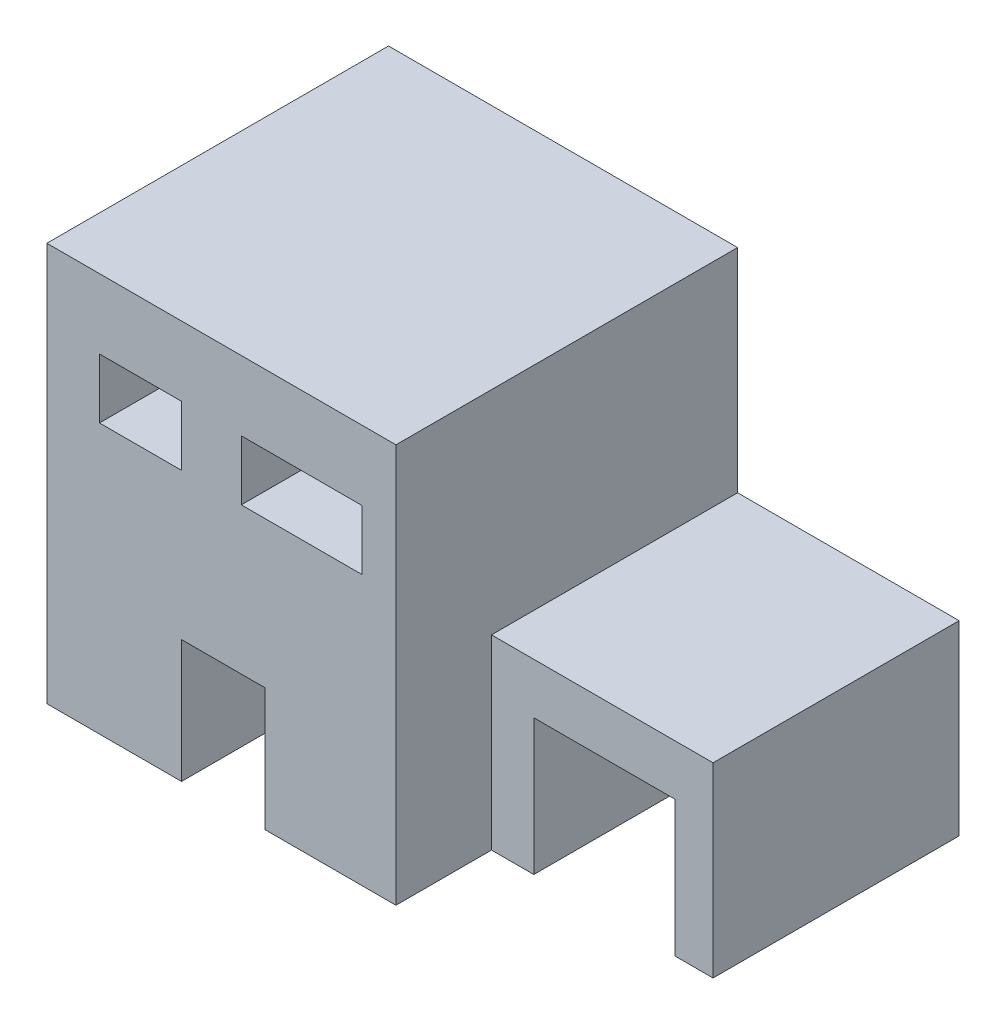
ISO-10303-21;
HEADER;
FILE_DESCRIPTION(('STEP AP214'),'2;1');
FILE_NAME('part.step','',(''),(''),'','','');
FILE_SCHEMA(('AUTOMOTIVE_DESIGN { 1 0 10303 214 1 1 1 1 }'));
ENDSEC;
DATA;
#1=APPLICATION_CONTEXT('core data for automotive mechanical design processes');
#2=APPLICATION_PROTOCOL_DEFINITION('international standard','automotive_design',2000,#1);
#3=PRODUCT_CONTEXT('',#1,'mechanical');
#4=PRODUCT('Part','Part','',(#3));
#5=PRODUCT_RELATED_PRODUCT_CATEGORY('part','',(#4));
#6=PRODUCT_DEFINITION_FORMATION('','',#4);
#7=PRODUCT_DEFINITION_CONTEXT('part definition',#1,'design');
#8=PRODUCT_DEFINITION('design','',#6,#7);
#9=PRODUCT_DEFINITION_SHAPE('','',#8);
#10=(LENGTH_UNIT() NAMED_UNIT(*) SI_UNIT(.MILLI.,.METRE.));
#11=(NAMED_UNIT(*) PLANE_ANGLE_UNIT() SI_UNIT($,.RADIAN.));
#12=(NAMED_UNIT(*) SI_UNIT($,.STERADIAN.) SOLID_ANGLE_UNIT());
#13=UNCERTAINTY_MEASURE_WITH_UNIT(LENGTH_MEASURE(1.E-05),#10,'distance_accuracy_value','');
#14=(GEOMETRIC_REPRESENTATION_CONTEXT(3) GLOBAL_UNCERTAINTY_ASSIGNED_CONTEXT((#13)) GLOBAL_UNIT_ASSIGNED_CONTEXT((#10,
#11,#12)) REPRESENTATION_CONTEXT('',''));
#15=CARTESIAN_POINT('',(0.,0.,0.));
#16=DIRECTION('',(0.,0.,1.));
#17=DIRECTION('',(1.,0.,0.));
#18=AXIS2_PLACEMENT_3D('',#15,#16,#17);
#19=CARTESIAN_POINT('',(0.,0.,0.));
#20=DIRECTION('',(0.,-1.,0.));
#21=DIRECTION('',(0.,0.,-1.));
#22=AXIS2_PLACEMENT_3D('',#19,#20,#21);
#23=PLANE('',#22);
#24=DIRECTION('',(0.,0.,1.));
#25=VECTOR('',#24,1.);
#26=CARTESIAN_POINT('',(88.3396516608017,0.,-110.));
#27=LINE('',#26,#25);
#28=CARTESIAN_POINT('',(88.3396516608017,0.,-77.1078953722334));
#29=VERTEX_POINT('',#28);
#30=CARTESIAN_POINT('',(88.3396516608017,0.,-21.5640714206499));
#31=VERTEX_POINT('',#30);
#32=EDGE_CURVE('E230',#29,#31,#27,.T.);
#33=ORIENTED_EDGE('',*,*,#32,.T.);
#34=DIRECTION('',(-1.,0.,0.));
#35=VECTOR('',#34,1.);
#36=CARTESIAN_POINT('',(128.786961770624,0.,-21.5640714206499));
#37=LINE('',#36,#35);
#38=CARTESIAN_POINT('',(78.7869617706238,0.,-21.5640714206499));
#39=VERTEX_POINT('',#38);
#40=EDGE_CURVE('E299',#31,#39,#37,.T.);
#41=ORIENTED_EDGE('',*,*,#40,.T.);
#42=DIRECTION('',(0.,0.,-1.));
#43=VECTOR('',#42,1.);
#44=CARTESIAN_POINT('',(78.7869617706238,0.,0.));
#45=LINE('',#44,#43);
#46=CARTESIAN_POINT('',(78.7869617706238,0.,0.));
#47=VERTEX_POINT('',#46);
#48=EDGE_CURVE('E321',#47,#39,#45,.T.);
#49=ORIENTED_EDGE('',*,*,#48,.F.);
#50=DIRECTION('',(1.,0.,0.));
#51=VECTOR('',#50,1.);
#52=CARTESIAN_POINT('',(0.,0.,0.));
#53=LINE('',#52,#51);
#54=CARTESIAN_POINT('',(49.1790629892825,0.,0.));
#55=VERTEX_POINT('',#54);
#56=EDGE_CURVE('E317',#55,#47,#53,.T.);
#57=ORIENTED_EDGE('',*,*,#56,.F.);
#58=DIRECTION('',(0.,0.,1.));
#59=VECTOR('',#58,1.);
#60=CARTESIAN_POINT('',(49.1790629892825,0.,0.));
#61=LINE('',#60,#59);
#62=CARTESIAN_POINT('',(49.1790629892825,0.,-77.1078953722334));
#63=VERTEX_POINT('',#62);
#64=EDGE_CURVE('E348',#63,#55,#61,.T.);
#65=ORIENTED_EDGE('',*,*,#64,.F.);
#66=DIRECTION('',(-1.,0.,0.));
#67=VECTOR('',#66,1.);
#68=CARTESIAN_POINT('',(0.,0.,-77.1078953722334));
#69=LINE('',#68,#67);
#70=EDGE_CURVE('E327',#29,#63,#69,.T.);
#71=ORIENTED_EDGE('',*,*,#70,.F.);
#72=EDGE_LOOP('',(#33,#41,#49,#57,#65,#71));
#73=FACE_BOUND('',#72,.T.);
#74=ADVANCED_FACE('F33',(#73),#23,.T.);
#75=DIRECTION('',(0.,0.,-1.));
#76=VECTOR('',#75,1.);
#77=CARTESIAN_POINT('',(30.3925643698374,0.,0.));
#78=LINE('',#77,#76);
#79=CARTESIAN_POINT('',(30.3925643698374,0.,0.));
#80=VERTEX_POINT('',#79);
#81=CARTESIAN_POINT('',(30.3925643698374,0.,-77.1078953722334));
#82=VERTEX_POINT('',#81);
#83=EDGE_CURVE('E350',#80,#82,#78,.T.);
#84=ORIENTED_EDGE('',*,*,#83,.F.);
#85=CARTESIAN_POINT('',(0.,0.,0.));
#86=VERTEX_POINT('',#85);
#87=EDGE_CURVE('E318',#86,#80,#53,.T.);
#88=ORIENTED_EDGE('',*,*,#87,.F.);
#89=DIRECTION('',(0.,0.,1.));
#90=VECTOR('',#89,1.);
#91=CARTESIAN_POINT('',(0.,0.,0.));
#92=LINE('',#91,#90);
#93=CARTESIAN_POINT('',(0.,0.,-77.1078953722334));
#94=VERTEX_POINT('',#93);
#95=EDGE_CURVE('E303',#94,#86,#92,.T.);
#96=ORIENTED_EDGE('',*,*,#95,.F.);
#97=EDGE_CURVE('E324',#82,#94,#69,.T.);
#98=ORIENTED_EDGE('',*,*,#97,.F.);
#99=EDGE_LOOP('',(#84,#88,#96,#98));
#100=FACE_BOUND('',#99,.T.);
#101=ADVANCED_FACE('F398',(#100),#23,.T.);
#102=CARTESIAN_POINT('',(78.7869617706238,90.,0.));
#103=DIRECTION('',(-1.,0.,0.));
#104=DIRECTION('',(0.,0.,1.));
#105=AXIS2_PLACEMENT_3D('',#102,#103,#104);
#106=PLANE('',#105);
#107=DIRECTION('',(0.,-1.,0.));
#108=VECTOR('',#107,1.);
#109=CARTESIAN_POINT('',(78.7869617706238,0.,-21.5640714206499));
#110=LINE('',#109,#108);
#111=CARTESIAN_POINT('',(78.7869617706238,42.0686481091275,-21.5640714206499));
#112=VERTEX_POINT('',#111);
#113=EDGE_CURVE('E277',#112,#39,#110,.T.);
#114=ORIENTED_EDGE('',*,*,#113,.F.);
#115=DIRECTION('',(0.,0.,1.));
#116=VECTOR('',#115,1.);
#117=CARTESIAN_POINT('',(78.7869617706238,42.0686481091275,-21.5640714206499));
#118=LINE('',#117,#116);
#119=CARTESIAN_POINT('',(78.7869617706238,42.0686481091275,-77.1078953722334));
#120=VERTEX_POINT('',#119);
#121=EDGE_CURVE('E282',#120,#112,#118,.T.);
#122=ORIENTED_EDGE('',*,*,#121,.F.);
#123=DIRECTION('',(0.,-1.,0.));
#124=VECTOR('',#123,1.);
#125=CARTESIAN_POINT('',(78.7869617706238,90.,-77.1078953722334));
#126=LINE('',#125,#124);
#127=CARTESIAN_POINT('',(78.7869617706238,90.,-77.1078953722334));
#128=VERTEX_POINT('',#127);
#129=EDGE_CURVE('E330',#128,#120,#126,.T.);
#130=ORIENTED_EDGE('',*,*,#129,.F.);
#131=DIRECTION('',(0.,0.,-1.));
#132=VECTOR('',#131,1.);
#133=CARTESIAN_POINT('',(78.7869617706238,90.,0.));
#134=LINE('',#133,#132);
#135=CARTESIAN_POINT('',(78.7869617706238,90.,0.));
#136=VERTEX_POINT('',#135);
#137=EDGE_CURVE('E310',#136,#128,#134,.T.);
#138=ORIENTED_EDGE('',*,*,#137,.F.);
#139=DIRECTION('',(0.,-1.,0.));
#140=VECTOR('',#139,1.);
#141=CARTESIAN_POINT('',(78.7869617706238,90.,0.));
#142=LINE('',#141,#140);
#143=EDGE_CURVE('E333',#136,#47,#142,.T.);
#144=ORIENTED_EDGE('',*,*,#143,.T.);
#145=ORIENTED_EDGE('',*,*,#48,.T.);
#146=EDGE_LOOP('',(#114,#122,#130,#138,#144,#145));
#147=FACE_BOUND('',#146,.T.);
#148=ADVANCED_FACE('F405',(#147),#106,.F.);
#149=CARTESIAN_POINT('',(0.,90.,0.));
#150=DIRECTION('',(1.,0.,0.));
#151=DIRECTION('',(0.,0.,-1.));
#152=AXIS2_PLACEMENT_3D('',#149,#150,#151);
#153=PLANE('',#152);
#154=ORIENTED_EDGE('',*,*,#95,.T.);
#155=DIRECTION('',(0.,-1.,0.));
#156=VECTOR('',#155,1.);
#157=CARTESIAN_POINT('',(0.,90.,0.));
#158=LINE('',#157,#156);
#159=CARTESIAN_POINT('',(0.,90.,0.));
#160=VERTEX_POINT('',#159);
#161=EDGE_CURVE('E336',#160,#86,#158,.T.);
#162=ORIENTED_EDGE('',*,*,#161,.F.);
#163=DIRECTION('',(0.,0.,1.));
#164=VECTOR('',#163,1.);
#165=CARTESIAN_POINT('',(0.,90.,0.));
#166=LINE('',#165,#164);
#167=CARTESIAN_POINT('',(0.,90.,-77.1078953722334));
#168=VERTEX_POINT('',#167);
#169=EDGE_CURVE('E304',#168,#160,#166,.T.);
#170=ORIENTED_EDGE('',*,*,#169,.F.);
#171=DIRECTION('',(0.,-1.,0.));
#172=VECTOR('',#171,1.);
#173=CARTESIAN_POINT('',(0.,90.,-77.1078953722334));
#174=LINE('',#173,#172);
#175=EDGE_CURVE('E314',#168,#94,#174,.T.);
#176=ORIENTED_EDGE('',*,*,#175,.T.);
#177=EDGE_LOOP('',(#154,#162,#170,#176));
#178=FACE_BOUND('',#177,.T.);
#179=ADVANCED_FACE('F35',(#178),#153,.F.);
#180=CARTESIAN_POINT('',(0.,90.,0.));
#181=DIRECTION('',(0.,0.,-1.));
#182=DIRECTION('',(-1.,0.,0.));
#183=AXIS2_PLACEMENT_3D('',#180,#181,#182);
#184=PLANE('',#183);
#185=DIRECTION('',(1.,0.,0.));
#186=VECTOR('',#185,1.);
#187=CARTESIAN_POINT('',(11.8706643224973,60.8097646832656,0.));
#188=LINE('',#187,#186);
#189=CARTESIAN_POINT('',(11.8706643224973,60.8097646832656,0.));
#190=VERTEX_POINT('',#189);
#191=CARTESIAN_POINT('',(30.3925643698374,60.8097646832656,0.));
#192=VERTEX_POINT('',#191);
#193=EDGE_CURVE('E235',#190,#192,#188,.T.);
#194=ORIENTED_EDGE('',*,*,#193,.F.);
#195=DIRECTION('',(0.,-1.,0.));
#196=VECTOR('',#195,1.);
#197=CARTESIAN_POINT('',(11.8706643224973,74.3042918606135,0.));
#198=LINE('',#197,#196);
#199=CARTESIAN_POINT('',(11.8706643224973,74.3042918606135,0.));
#200=VERTEX_POINT('',#199);
#201=EDGE_CURVE('E48',#200,#190,#198,.T.);
#202=ORIENTED_EDGE('',*,*,#201,.F.);
#203=DIRECTION('',(-1.,0.,0.));
#204=VECTOR('',#203,1.);
#205=CARTESIAN_POINT('',(11.8706643224973,74.3042918606135,0.));
#206=LINE('',#205,#204);
#207=CARTESIAN_POINT('',(30.3925643698374,74.3042918606135,0.));
#208=VERTEX_POINT('',#207);
#209=EDGE_CURVE('E241',#208,#200,#206,.T.);
#210=ORIENTED_EDGE('',*,*,#209,.F.);
#211=DIRECTION('',(0.,1.,0.));
#212=VECTOR('',#211,1.);
#213=CARTESIAN_POINT('',(30.3925643698374,74.3042918606135,0.));
#214=LINE('',#213,#212);
#215=EDGE_CURVE('E238',#192,#208,#214,.T.);
#216=ORIENTED_EDGE('',*,*,#215,.F.);
#217=EDGE_LOOP('',(#194,#202,#210,#216));
#218=FACE_BOUND('',#217,.T.);
#219=DIRECTION('',(1.,0.,0.));
#220=VECTOR('',#219,1.);
#221=CARTESIAN_POINT('',(43.8870915471853,60.8097646832656,0.));
#222=LINE('',#221,#220);
#223=CARTESIAN_POINT('',(43.8870915471853,60.8097646832656,0.));
#224=VERTEX_POINT('',#223);
#225=CARTESIAN_POINT('',(71.1407444739858,60.8097646832656,0.));
#226=VERTEX_POINT('',#225);
#227=EDGE_CURVE('E205',#224,#226,#222,.T.);
#228=ORIENTED_EDGE('',*,*,#227,.F.);
#229=DIRECTION('',(0.,-1.,0.));
#230=VECTOR('',#229,1.);
#231=CARTESIAN_POINT('',(43.8870915471853,74.3042918606135,0.));
#232=LINE('',#231,#230);
#233=CARTESIAN_POINT('',(43.8870915471853,74.3042918606135,0.));
#234=VERTEX_POINT('',#233);
#235=EDGE_CURVE('E56',#234,#224,#232,.T.);
#236=ORIENTED_EDGE('',*,*,#235,.F.);
#237=DIRECTION('',(-1.,0.,0.));
#238=VECTOR('',#237,1.);
#239=CARTESIAN_POINT('',(43.8870915471853,74.3042918606135,0.));
#240=LINE('',#239,#238);
#241=CARTESIAN_POINT('',(71.1407444739858,74.3042918606135,0.));
#242=VERTEX_POINT('',#241);
#243=EDGE_CURVE('E212',#242,#234,#240,.T.);
#244=ORIENTED_EDGE('',*,*,#243,.F.);
#245=DIRECTION('',(0.,1.,0.));
#246=VECTOR('',#245,1.);
#247=CARTESIAN_POINT('',(71.1407444739858,74.3042918606135,0.));
#248=LINE('',#247,#246);
#249=EDGE_CURVE('E195',#226,#242,#248,.T.);
#250=ORIENTED_EDGE('',*,*,#249,.F.);
#251=EDGE_LOOP('',(#228,#236,#244,#250));
#252=FACE_BOUND('',#251,.T.);
#253=ORIENTED_EDGE('',*,*,#87,.T.);
#254=DIRECTION('',(0.,-1.,0.));
#255=VECTOR('',#254,1.);
#256=CARTESIAN_POINT('',(30.3925643698374,0.,0.));
#257=LINE('',#256,#255);
#258=CARTESIAN_POINT('',(30.3925643698374,27.7349431701582,0.));
#259=VERTEX_POINT('',#258);
#260=EDGE_CURVE('E224',#259,#80,#257,.T.);
#261=ORIENTED_EDGE('',*,*,#260,.F.);
#262=DIRECTION('',(-1.,0.,0.));
#263=VECTOR('',#262,1.);
#264=CARTESIAN_POINT('',(30.3925643698374,27.7349431701582,0.));
#265=LINE('',#264,#263);
#266=CARTESIAN_POINT('',(49.1790629892825,27.7349431701582,0.));
#267=VERTEX_POINT('',#266);
#268=EDGE_CURVE('E255',#267,#259,#265,.T.);
#269=ORIENTED_EDGE('',*,*,#268,.F.);
#270=DIRECTION('',(0.,1.,0.));
#271=VECTOR('',#270,1.);
#272=CARTESIAN_POINT('',(49.1790629892825,0.,0.));
#273=LINE('',#272,#271);
#274=EDGE_CURVE('E252',#55,#267,#273,.T.);
#275=ORIENTED_EDGE('',*,*,#274,.F.);
#276=ORIENTED_EDGE('',*,*,#56,.T.);
#277=ORIENTED_EDGE('',*,*,#143,.F.);
#278=DIRECTION('',(1.,0.,0.));
#279=VECTOR('',#278,1.);
#280=CARTESIAN_POINT('',(0.,90.,0.));
#281=LINE('',#280,#279);
#282=EDGE_CURVE('E307',#160,#136,#281,.T.);
#283=ORIENTED_EDGE('',*,*,#282,.F.);
#284=ORIENTED_EDGE('',*,*,#161,.T.);
#285=EDGE_LOOP('',(#253,#261,#269,#275,#276,#277,#283,#284));
#286=FACE_BOUND('',#285,.T.);
#287=ADVANCED_FACE('F209',(#218,#252,#286),#184,.F.);
#288=CARTESIAN_POINT('',(0.,90.,-77.1078953722334));
#289=DIRECTION('',(0.,0.,1.));
#290=DIRECTION('',(1.,0.,0.));
#291=AXIS2_PLACEMENT_3D('',#288,#289,#290);
#292=PLANE('',#291);
#293=DIRECTION('',(-1.,0.,0.));
#294=VECTOR('',#293,1.);
#295=CARTESIAN_POINT('',(0.,74.3042918606135,-77.1078953722334));
#296=LINE('',#295,#294);
#297=CARTESIAN_POINT('',(30.3925643698374,74.3042918606135,-77.1078953722334));
#298=VERTEX_POINT('',#297);
#299=CARTESIAN_POINT('',(11.8706643224973,74.3042918606135,-77.1078953722334));
#300=VERTEX_POINT('',#299);
#301=EDGE_CURVE('E41',#298,#300,#296,.T.);
#302=ORIENTED_EDGE('',*,*,#301,.T.);
#303=DIRECTION('',(0.,-1.,0.));
#304=VECTOR('',#303,1.);
#305=CARTESIAN_POINT('',(11.8706643224973,90.,-77.1078953722334));
#306=LINE('',#305,#304);
#307=CARTESIAN_POINT('',(11.8706643224973,60.8097646832656,-77.1078953722334));
#308=VERTEX_POINT('',#307);
#309=EDGE_CURVE('E11',#300,#308,#306,.T.);
#310=ORIENTED_EDGE('',*,*,#309,.T.);
#311=DIRECTION('',(1.,0.,0.));
#312=VECTOR('',#311,1.);
#313=CARTESIAN_POINT('',(0.,60.8097646832656,-77.1078953722334));
#314=LINE('',#313,#312);
#315=CARTESIAN_POINT('',(30.3925643698374,60.8097646832656,-77.1078953722334));
#316=VERTEX_POINT('',#315);
#317=EDGE_CURVE('E364',#308,#316,#314,.T.);
#318=ORIENTED_EDGE('',*,*,#317,.T.);
#319=DIRECTION('',(0.,1.,0.));
#320=VECTOR('',#319,1.);
#321=CARTESIAN_POINT('',(30.3925643698374,90.,-77.1078953722334));
#322=LINE('',#321,#320);
#323=EDGE_CURVE('E367',#316,#298,#322,.T.);
#324=ORIENTED_EDGE('',*,*,#323,.T.);
#325=EDGE_LOOP('',(#302,#310,#318,#324));
#326=FACE_BOUND('',#325,.T.);
#327=DIRECTION('',(-1.,0.,0.));
#328=VECTOR('',#327,1.);
#329=CARTESIAN_POINT('',(0.,74.3042918606135,-77.1078953722334));
#330=LINE('',#329,#328);
#331=CARTESIAN_POINT('',(71.1407444739858,74.3042918606135,-77.1078953722334));
#332=VERTEX_POINT('',#331);
#333=CARTESIAN_POINT('',(43.8870915471853,74.3042918606135,-77.1078953722334));
#334=VERTEX_POINT('',#333);
#335=EDGE_CURVE('E358',#332,#334,#330,.T.);
#336=ORIENTED_EDGE('',*,*,#335,.T.);
#337=DIRECTION('',(0.,-1.,0.));
#338=VECTOR('',#337,1.);
#339=CARTESIAN_POINT('',(43.8870915471853,90.,-77.1078953722334));
#340=LINE('',#339,#338);
#341=CARTESIAN_POINT('',(43.8870915471853,60.8097646832656,-77.1078953722334));
#342=VERTEX_POINT('',#341);
#343=EDGE_CURVE('E361',#334,#342,#340,.T.);
#344=ORIENTED_EDGE('',*,*,#343,.T.);
#345=DIRECTION('',(1.,0.,0.));
#346=VECTOR('',#345,1.);
#347=CARTESIAN_POINT('',(0.,60.8097646832656,-77.1078953722334));
#348=LINE('',#347,#346);
#349=CARTESIAN_POINT('',(71.1407444739858,60.8097646832656,-77.1078953722334));
#350=VERTEX_POINT('',#349);
#351=EDGE_CURVE('E355',#342,#350,#348,.T.);
#352=ORIENTED_EDGE('',*,*,#351,.T.);
#353=DIRECTION('',(0.,1.,0.));
#354=VECTOR('',#353,1.);
#355=CARTESIAN_POINT('',(71.1407444739858,90.,-77.1078953722334));
#356=LINE('',#355,#354);
#357=EDGE_CURVE('E198',#350,#332,#356,.T.);
#358=ORIENTED_EDGE('',*,*,#357,.T.);
#359=EDGE_LOOP('',(#336,#344,#352,#358));
#360=FACE_BOUND('',#359,.T.);
#361=DIRECTION('',(-1.,0.,0.));
#362=VECTOR('',#361,1.);
#363=CARTESIAN_POINT('',(0.,30.6455274633116,-77.1078953722334));
#364=LINE('',#363,#362);
#365=CARTESIAN_POINT('',(120.223779599437,30.6455274633116,-77.1078953722334));
#366=VERTEX_POINT('',#365);
#367=CARTESIAN_POINT('',(88.3396516608017,30.6455274633116,-77.1078953722334));
#368=VERTEX_POINT('',#367);
#369=EDGE_CURVE('E265',#366,#368,#364,.T.);
#370=ORIENTED_EDGE('',*,*,#369,.T.);
#371=DIRECTION('',(0.,-1.,0.));
#372=VECTOR('',#371,1.);
#373=CARTESIAN_POINT('',(88.3396516608017,90.,-77.1078953722334));
#374=LINE('',#373,#372);
#375=EDGE_CURVE('E268',#368,#29,#374,.T.);
#376=ORIENTED_EDGE('',*,*,#375,.T.);
#377=ORIENTED_EDGE('',*,*,#70,.T.);
#378=DIRECTION('',(0.,1.,0.));
#379=VECTOR('',#378,1.);
#380=CARTESIAN_POINT('',(49.1790629892825,90.,-77.1078953722334));
#381=LINE('',#380,#379);
#382=CARTESIAN_POINT('',(49.1790629892825,27.7349431701582,-77.1078953722334));
#383=VERTEX_POINT('',#382);
#384=EDGE_CURVE('E271',#63,#383,#381,.T.);
#385=ORIENTED_EDGE('',*,*,#384,.T.);
#386=DIRECTION('',(-1.,0.,0.));
#387=VECTOR('',#386,1.);
#388=CARTESIAN_POINT('',(0.,27.7349431701582,-77.1078953722334));
#389=LINE('',#388,#387);
#390=CARTESIAN_POINT('',(30.3925643698374,27.7349431701582,-77.1078953722334));
#391=VERTEX_POINT('',#390);
#392=EDGE_CURVE('E352',#383,#391,#389,.T.);
#393=ORIENTED_EDGE('',*,*,#392,.T.);
#394=DIRECTION('',(0.,-1.,0.));
#395=VECTOR('',#394,1.);
#396=CARTESIAN_POINT('',(30.3925643698374,90.,-77.1078953722334));
#397=LINE('',#396,#395);
#398=EDGE_CURVE('E274',#391,#82,#397,.T.);
#399=ORIENTED_EDGE('',*,*,#398,.T.);
#400=ORIENTED_EDGE('',*,*,#97,.T.);
#401=ORIENTED_EDGE('',*,*,#175,.F.);
#402=DIRECTION('',(-1.,0.,0.));
#403=VECTOR('',#402,1.);
#404=CARTESIAN_POINT('',(0.,90.,-77.1078953722334));
#405=LINE('',#404,#403);
#406=EDGE_CURVE('E312',#128,#168,#405,.T.);
#407=ORIENTED_EDGE('',*,*,#406,.F.);
#408=ORIENTED_EDGE('',*,*,#129,.T.);
#409=DIRECTION('',(-1.,0.,0.));
#410=VECTOR('',#409,1.);
#411=CARTESIAN_POINT('',(128.786961770624,42.0686481091275,-77.1078953722334));
#412=LINE('',#411,#410);
#413=CARTESIAN_POINT('',(128.786961770624,42.0686481091275,-77.1078953722334));
#414=VERTEX_POINT('',#413);
#415=EDGE_CURVE('E296',#414,#120,#412,.T.);
#416=ORIENTED_EDGE('',*,*,#415,.F.);
#417=DIRECTION('',(0.,1.,0.));
#418=VECTOR('',#417,1.);
#419=CARTESIAN_POINT('',(128.786961770624,0.,-77.1078953722334));
#420=LINE('',#419,#418);
#421=CARTESIAN_POINT('',(128.786961770624,0.,-77.1078953722334));
#422=VERTEX_POINT('',#421);
#423=EDGE_CURVE('E285',#422,#414,#420,.T.);
#424=ORIENTED_EDGE('',*,*,#423,.F.);
#425=CARTESIAN_POINT('',(120.223779599437,0.,-77.1078953722334));
#426=VERTEX_POINT('',#425);
#427=EDGE_CURVE('E308',#422,#426,#69,.T.);
#428=ORIENTED_EDGE('',*,*,#427,.T.);
#429=DIRECTION('',(0.,1.,0.));
#430=VECTOR('',#429,1.);
#431=CARTESIAN_POINT('',(120.223779599437,90.,-77.1078953722334));
#432=LINE('',#431,#430);
#433=EDGE_CURVE('E261',#426,#366,#432,.T.);
#434=ORIENTED_EDGE('',*,*,#433,.T.);
#435=EDGE_LOOP('',(#370,#376,#377,#385,#393,#399,#400,#401,#407,#408,#416,#424,#428,#434));
#436=FACE_BOUND('',#435,.T.);
#437=ADVANCED_FACE('F371',(#326,#360,#436),#292,.F.);
#438=CARTESIAN_POINT('',(0.,90.,0.));
#439=DIRECTION('',(0.,-1.,0.));
#440=DIRECTION('',(0.,0.,-1.));
#441=AXIS2_PLACEMENT_3D('',#438,#439,#440);
#442=PLANE('',#441);
#443=ORIENTED_EDGE('',*,*,#169,.T.);
#444=ORIENTED_EDGE('',*,*,#282,.T.);
#445=ORIENTED_EDGE('',*,*,#137,.T.);
#446=ORIENTED_EDGE('',*,*,#406,.T.);
#447=EDGE_LOOP('',(#443,#444,#445,#446));
#448=FACE_BOUND('',#447,.T.);
#449=ADVANCED_FACE('F411',(#448),#442,.F.);
#450=DIRECTION('',(0.,0.,1.));
#451=VECTOR('',#450,1.);
#452=CARTESIAN_POINT('',(120.223779599437,0.,-110.));
#453=LINE('',#452,#451);
#454=CARTESIAN_POINT('',(120.223779599437,0.,-21.5640714206499));
#455=VERTEX_POINT('',#454);
#456=EDGE_CURVE('E228',#426,#455,#453,.T.);
#457=ORIENTED_EDGE('',*,*,#456,.F.);
#458=ORIENTED_EDGE('',*,*,#427,.F.);
#459=DIRECTION('',(0.,0.,-1.));
#460=VECTOR('',#459,1.);
#461=CARTESIAN_POINT('',(128.786961770624,0.,-21.5640714206499));
#462=LINE('',#461,#460);
#463=CARTESIAN_POINT('',(128.786961770624,0.,-21.5640714206499));
#464=VERTEX_POINT('',#463);
#465=EDGE_CURVE('E281',#464,#422,#462,.T.);
#466=ORIENTED_EDGE('',*,*,#465,.F.);
#467=EDGE_CURVE('E300',#464,#455,#37,.T.);
#468=ORIENTED_EDGE('',*,*,#467,.T.);
#469=EDGE_LOOP('',(#457,#458,#466,#468));
#470=FACE_BOUND('',#469,.T.);
#471=ADVANCED_FACE('F401',(#470),#23,.T.);
#472=CARTESIAN_POINT('',(128.786961770624,0.,-21.5640714206499));
#473=DIRECTION('',(0.,0.,-1.));
#474=DIRECTION('',(-1.,0.,0.));
#475=AXIS2_PLACEMENT_3D('',#472,#473,#474);
#476=PLANE('',#475);
#477=ORIENTED_EDGE('',*,*,#40,.F.);
#478=DIRECTION('',(0.,1.,0.));
#479=VECTOR('',#478,1.);
#480=CARTESIAN_POINT('',(88.3396516608017,0.,-21.5640714206499));
#481=LINE('',#480,#479);
#482=CARTESIAN_POINT('',(88.3396516608017,30.6455274633116,-21.5640714206499));
#483=VERTEX_POINT('',#482);
#484=EDGE_CURVE('E345',#31,#483,#481,.T.);
#485=ORIENTED_EDGE('',*,*,#484,.T.);
#486=DIRECTION('',(1.,0.,0.));
#487=VECTOR('',#486,1.);
#488=CARTESIAN_POINT('',(128.786961770624,30.6455274633116,-21.5640714206499));
#489=LINE('',#488,#487);
#490=CARTESIAN_POINT('',(120.223779599437,30.6455274633116,-21.5640714206499));
#491=VERTEX_POINT('',#490);
#492=EDGE_CURVE('E342',#483,#491,#489,.T.);
#493=ORIENTED_EDGE('',*,*,#492,.T.);
#494=DIRECTION('',(0.,-1.,0.));
#495=VECTOR('',#494,1.);
#496=CARTESIAN_POINT('',(120.223779599437,0.,-21.5640714206499));
#497=LINE('',#496,#495);
#498=EDGE_CURVE('E339',#491,#455,#497,.T.);
#499=ORIENTED_EDGE('',*,*,#498,.T.);
#500=ORIENTED_EDGE('',*,*,#467,.F.);
#501=DIRECTION('',(0.,-1.,0.));
#502=VECTOR('',#501,1.);
#503=CARTESIAN_POINT('',(128.786961770624,0.,-21.5640714206499));
#504=LINE('',#503,#502);
#505=CARTESIAN_POINT('',(128.786961770624,42.0686481091275,-21.5640714206499));
#506=VERTEX_POINT('',#505);
#507=EDGE_CURVE('E278',#506,#464,#504,.T.);
#508=ORIENTED_EDGE('',*,*,#507,.F.);
#509=DIRECTION('',(-1.,0.,0.));
#510=VECTOR('',#509,1.);
#511=CARTESIAN_POINT('',(128.786961770624,42.0686481091275,-21.5640714206499));
#512=LINE('',#511,#510);
#513=EDGE_CURVE('E289',#506,#112,#512,.T.);
#514=ORIENTED_EDGE('',*,*,#513,.T.);
#515=ORIENTED_EDGE('',*,*,#113,.T.);
#516=EDGE_LOOP('',(#477,#485,#493,#499,#500,#508,#514,#515));
#517=FACE_BOUND('',#516,.T.);
#518=ADVANCED_FACE('F410',(#517),#476,.F.);
#519=CARTESIAN_POINT('',(128.786961770624,42.0686481091275,-21.5640714206499));
#520=DIRECTION('',(0.,-1.,0.));
#521=DIRECTION('',(0.,0.,-1.));
#522=AXIS2_PLACEMENT_3D('',#519,#520,#521);
#523=PLANE('',#522);
#524=ORIENTED_EDGE('',*,*,#121,.T.);
#525=ORIENTED_EDGE('',*,*,#513,.F.);
#526=DIRECTION('',(0.,0.,1.));
#527=VECTOR('',#526,1.);
#528=CARTESIAN_POINT('',(128.786961770624,42.0686481091275,-21.5640714206499));
#529=LINE('',#528,#527);
#530=EDGE_CURVE('E287',#414,#506,#529,.T.);
#531=ORIENTED_EDGE('',*,*,#530,.F.);
#532=ORIENTED_EDGE('',*,*,#415,.T.);
#533=EDGE_LOOP('',(#524,#525,#531,#532));
#534=FACE_BOUND('',#533,.T.);
#535=ADVANCED_FACE('F417',(#534),#523,.F.);
#536=CARTESIAN_POINT('',(128.786961770624,0.,0.));
#537=DIRECTION('',(-1.,0.,0.));
#538=DIRECTION('',(0.,0.,1.));
#539=AXIS2_PLACEMENT_3D('',#536,#537,#538);
#540=PLANE('',#539);
#541=ORIENTED_EDGE('',*,*,#507,.T.);
#542=ORIENTED_EDGE('',*,*,#465,.T.);
#543=ORIENTED_EDGE('',*,*,#423,.T.);
#544=ORIENTED_EDGE('',*,*,#530,.T.);
#545=EDGE_LOOP('',(#541,#542,#543,#544));
#546=FACE_BOUND('',#545,.T.);
#547=ADVANCED_FACE('F429',(#546),#540,.F.);
#548=CARTESIAN_POINT('',(88.3396516608017,0.,-110.));
#549=DIRECTION('',(-1.,0.,0.));
#550=DIRECTION('',(0.,0.,1.));
#551=AXIS2_PLACEMENT_3D('',#548,#549,#550);
#552=PLANE('',#551);
#553=DIRECTION('',(0.,0.,1.));
#554=VECTOR('',#553,1.);
#555=CARTESIAN_POINT('',(88.3396516608017,30.6455274633116,-110.));
#556=LINE('',#555,#554);
#557=EDGE_CURVE('E221',#368,#483,#556,.T.);
#558=ORIENTED_EDGE('',*,*,#557,.T.);
#559=ORIENTED_EDGE('',*,*,#484,.F.);
#560=ORIENTED_EDGE('',*,*,#32,.F.);
#561=ORIENTED_EDGE('',*,*,#375,.F.);
#562=EDGE_LOOP('',(#558,#559,#560,#561));
#563=FACE_BOUND('',#562,.T.);
#564=ADVANCED_FACE('F479',(#563),#552,.F.);
#565=CARTESIAN_POINT('',(88.3396516608017,30.6455274633116,-110.));
#566=DIRECTION('',(0.,1.,0.));
#567=DIRECTION('',(0.,0.,1.));
#568=AXIS2_PLACEMENT_3D('',#565,#566,#567);
#569=PLANE('',#568);
#570=DIRECTION('',(0.,0.,1.));
#571=VECTOR('',#570,1.);
#572=CARTESIAN_POINT('',(120.223779599437,30.6455274633116,-110.));
#573=LINE('',#572,#571);
#574=EDGE_CURVE('E225',#366,#491,#573,.T.);
#575=ORIENTED_EDGE('',*,*,#574,.T.);
#576=ORIENTED_EDGE('',*,*,#492,.F.);
#577=ORIENTED_EDGE('',*,*,#557,.F.);
#578=ORIENTED_EDGE('',*,*,#369,.F.);
#579=EDGE_LOOP('',(#575,#576,#577,#578));
#580=FACE_BOUND('',#579,.T.);
#581=ADVANCED_FACE('F436',(#580),#569,.F.);
#582=CARTESIAN_POINT('',(120.223779599437,0.,-110.));
#583=DIRECTION('',(1.,0.,0.));
#584=DIRECTION('',(0.,0.,-1.));
#585=AXIS2_PLACEMENT_3D('',#582,#583,#584);
#586=PLANE('',#585);
#587=ORIENTED_EDGE('',*,*,#456,.T.);
#588=ORIENTED_EDGE('',*,*,#498,.F.);
#589=ORIENTED_EDGE('',*,*,#574,.F.);
#590=ORIENTED_EDGE('',*,*,#433,.F.);
#591=EDGE_LOOP('',(#587,#588,#589,#590));
#592=FACE_BOUND('',#591,.T.);
#593=ADVANCED_FACE('F434',(#592),#586,.F.);
#594=CARTESIAN_POINT('',(30.3925643698374,27.7349431701582,-110.));
#595=DIRECTION('',(0.,1.,0.));
#596=DIRECTION('',(0.,0.,1.));
#597=AXIS2_PLACEMENT_3D('',#594,#595,#596);
#598=PLANE('',#597);
#599=DIRECTION('',(0.,0.,1.));
#600=VECTOR('',#599,1.);
#601=CARTESIAN_POINT('',(49.1790629892825,27.7349431701582,-110.));
#602=LINE('',#601,#600);
#603=EDGE_CURVE('E258',#383,#267,#602,.T.);
#604=ORIENTED_EDGE('',*,*,#603,.T.);
#605=ORIENTED_EDGE('',*,*,#268,.T.);
#606=DIRECTION('',(0.,0.,1.));
#607=VECTOR('',#606,1.);
#608=CARTESIAN_POINT('',(30.3925643698374,27.7349431701582,-110.));
#609=LINE('',#608,#607);
#610=EDGE_CURVE('E259',#391,#259,#609,.T.);
#611=ORIENTED_EDGE('',*,*,#610,.F.);
#612=ORIENTED_EDGE('',*,*,#392,.F.);
#613=EDGE_LOOP('',(#604,#605,#611,#612));
#614=FACE_BOUND('',#613,.T.);
#615=ADVANCED_FACE('F465',(#614),#598,.F.);
#616=CARTESIAN_POINT('',(30.3925643698374,0.,-110.));
#617=DIRECTION('',(-1.,0.,0.));
#618=DIRECTION('',(0.,0.,1.));
#619=AXIS2_PLACEMENT_3D('',#616,#617,#618);
#620=PLANE('',#619);
#621=ORIENTED_EDGE('',*,*,#610,.T.);
#622=ORIENTED_EDGE('',*,*,#260,.T.);
#623=ORIENTED_EDGE('',*,*,#83,.T.);
#624=ORIENTED_EDGE('',*,*,#398,.F.);
#625=EDGE_LOOP('',(#621,#622,#623,#624));
#626=FACE_BOUND('',#625,.T.);
#627=ADVANCED_FACE('F467',(#626),#620,.F.);
#628=CARTESIAN_POINT('',(49.1790629892825,0.,-110.));
#629=DIRECTION('',(1.,0.,0.));
#630=DIRECTION('',(0.,0.,-1.));
#631=AXIS2_PLACEMENT_3D('',#628,#629,#630);
#632=PLANE('',#631);
#633=ORIENTED_EDGE('',*,*,#64,.T.);
#634=ORIENTED_EDGE('',*,*,#274,.T.);
#635=ORIENTED_EDGE('',*,*,#603,.F.);
#636=ORIENTED_EDGE('',*,*,#384,.F.);
#637=EDGE_LOOP('',(#633,#634,#635,#636));
#638=FACE_BOUND('',#637,.T.);
#639=ADVANCED_FACE('F462',(#638),#632,.F.);
#640=CARTESIAN_POINT('',(43.8870915471853,74.3042918606135,-110.));
#641=DIRECTION('',(-1.,0.,0.));
#642=DIRECTION('',(0.,0.,1.));
#643=AXIS2_PLACEMENT_3D('',#640,#641,#642);
#644=PLANE('',#643);
#645=DIRECTION('',(0.,0.,1.));
#646=VECTOR('',#645,1.);
#647=CARTESIAN_POINT('',(43.8870915471853,74.3042918606135,-110.));
#648=LINE('',#647,#646);
#649=EDGE_CURVE('E217',#334,#234,#648,.T.);
#650=ORIENTED_EDGE('',*,*,#649,.T.);
#651=ORIENTED_EDGE('',*,*,#235,.T.);
#652=DIRECTION('',(0.,0.,1.));
#653=VECTOR('',#652,1.);
#654=CARTESIAN_POINT('',(43.8870915471853,60.8097646832656,-110.));
#655=LINE('',#654,#653);
#656=EDGE_CURVE('E202',#342,#224,#655,.T.);
#657=ORIENTED_EDGE('',*,*,#656,.F.);
#658=ORIENTED_EDGE('',*,*,#343,.F.);
#659=EDGE_LOOP('',(#650,#651,#657,#658));
#660=FACE_BOUND('',#659,.T.);
#661=ADVANCED_FACE('F474',(#660),#644,.F.);
#662=CARTESIAN_POINT('',(43.8870915471853,74.3042918606135,-110.));
#663=DIRECTION('',(0.,1.,0.));
#664=DIRECTION('',(0.,0.,1.));
#665=AXIS2_PLACEMENT_3D('',#662,#663,#664);
#666=PLANE('',#665);
#667=DIRECTION('',(0.,0.,1.));
#668=VECTOR('',#667,1.);
#669=CARTESIAN_POINT('',(71.1407444739858,74.3042918606135,-110.));
#670=LINE('',#669,#668);
#671=EDGE_CURVE('E201',#332,#242,#670,.T.);
#672=ORIENTED_EDGE('',*,*,#671,.T.);
#673=ORIENTED_EDGE('',*,*,#243,.T.);
#674=ORIENTED_EDGE('',*,*,#649,.F.);
#675=ORIENTED_EDGE('',*,*,#335,.F.);
#676=EDGE_LOOP('',(#672,#673,#674,#675));
#677=FACE_BOUND('',#676,.T.);
#678=ADVANCED_FACE('F531',(#677),#666,.F.);
#679=CARTESIAN_POINT('',(71.1407444739858,74.3042918606135,-110.));
#680=DIRECTION('',(1.,0.,0.));
#681=DIRECTION('',(0.,0.,-1.));
#682=AXIS2_PLACEMENT_3D('',#679,#680,#681);
#683=PLANE('',#682);
#684=DIRECTION('',(0.,0.,1.));
#685=VECTOR('',#684,1.);
#686=CARTESIAN_POINT('',(71.1407444739858,60.8097646832656,-110.));
#687=LINE('',#686,#685);
#688=EDGE_CURVE('E190',#350,#226,#687,.T.);
#689=ORIENTED_EDGE('',*,*,#688,.T.);
#690=ORIENTED_EDGE('',*,*,#249,.T.);
#691=ORIENTED_EDGE('',*,*,#671,.F.);
#692=ORIENTED_EDGE('',*,*,#357,.F.);
#693=EDGE_LOOP('',(#689,#690,#691,#692));
#694=FACE_BOUND('',#693,.T.);
#695=ADVANCED_FACE('F192',(#694),#683,.F.);
#696=CARTESIAN_POINT('',(43.8870915471853,60.8097646832656,-110.));
#697=DIRECTION('',(0.,-1.,0.));
#698=DIRECTION('',(0.,0.,-1.));
#699=AXIS2_PLACEMENT_3D('',#696,#697,#698);
#700=PLANE('',#699);
#701=ORIENTED_EDGE('',*,*,#656,.T.);
#702=ORIENTED_EDGE('',*,*,#227,.T.);
#703=ORIENTED_EDGE('',*,*,#688,.F.);
#704=ORIENTED_EDGE('',*,*,#351,.F.);
#705=EDGE_LOOP('',(#701,#702,#703,#704));
#706=FACE_BOUND('',#705,.T.);
#707=ADVANCED_FACE('F206',(#706),#700,.F.);
#708=CARTESIAN_POINT('',(11.8706643224973,74.3042918606135,-110.));
#709=DIRECTION('',(-1.,0.,0.));
#710=DIRECTION('',(0.,0.,1.));
#711=AXIS2_PLACEMENT_3D('',#708,#709,#710);
#712=PLANE('',#711);
#713=DIRECTION('',(0.,0.,1.));
#714=VECTOR('',#713,1.);
#715=CARTESIAN_POINT('',(11.8706643224973,74.3042918606135,-110.));
#716=LINE('',#715,#714);
#717=EDGE_CURVE('E233',#300,#200,#716,.T.);
#718=ORIENTED_EDGE('',*,*,#717,.T.);
#719=ORIENTED_EDGE('',*,*,#201,.T.);
#720=DIRECTION('',(0.,0.,1.));
#721=VECTOR('',#720,1.);
#722=CARTESIAN_POINT('',(11.8706643224973,60.8097646832656,-110.));
#723=LINE('',#722,#721);
#724=EDGE_CURVE('E244',#308,#190,#723,.T.);
#725=ORIENTED_EDGE('',*,*,#724,.F.);
#726=ORIENTED_EDGE('',*,*,#309,.F.);
#727=EDGE_LOOP('',(#718,#719,#725,#726));
#728=FACE_BOUND('',#727,.T.);
#729=ADVANCED_FACE('F386',(#728),#712,.F.);
#730=CARTESIAN_POINT('',(11.8706643224973,74.3042918606135,-110.));
#731=DIRECTION('',(0.,1.,0.));
#732=DIRECTION('',(0.,0.,1.));
#733=AXIS2_PLACEMENT_3D('',#730,#731,#732);
#734=PLANE('',#733);
#735=DIRECTION('',(0.,0.,1.));
#736=VECTOR('',#735,1.);
#737=CARTESIAN_POINT('',(30.3925643698374,74.3042918606135,-110.));
#738=LINE('',#737,#736);
#739=EDGE_CURVE('E246',#298,#208,#738,.T.);
#740=ORIENTED_EDGE('',*,*,#739,.T.);
#741=ORIENTED_EDGE('',*,*,#209,.T.);
#742=ORIENTED_EDGE('',*,*,#717,.F.);
#743=ORIENTED_EDGE('',*,*,#301,.F.);
#744=EDGE_LOOP('',(#740,#741,#742,#743));
#745=FACE_BOUND('',#744,.T.);
#746=ADVANCED_FACE('F377',(#745),#734,.F.);
#747=CARTESIAN_POINT('',(30.3925643698374,74.3042918606135,-110.));
#748=DIRECTION('',(1.,0.,0.));
#749=DIRECTION('',(0.,0.,-1.));
#750=AXIS2_PLACEMENT_3D('',#747,#748,#749);
#751=PLANE('',#750);
#752=DIRECTION('',(0.,0.,1.));
#753=VECTOR('',#752,1.);
#754=CARTESIAN_POINT('',(30.3925643698374,60.8097646832656,-110.));
#755=LINE('',#754,#753);
#756=EDGE_CURVE('E248',#316,#192,#755,.T.);
#757=ORIENTED_EDGE('',*,*,#756,.T.);
#758=ORIENTED_EDGE('',*,*,#215,.T.);
#759=ORIENTED_EDGE('',*,*,#739,.F.);
#760=ORIENTED_EDGE('',*,*,#323,.F.);
#761=EDGE_LOOP('',(#757,#758,#759,#760));
#762=FACE_BOUND('',#761,.T.);
#763=ADVANCED_FACE('F379',(#762),#751,.F.);
#764=CARTESIAN_POINT('',(11.8706643224973,60.8097646832656,-110.));
#765=DIRECTION('',(0.,-1.,0.));
#766=DIRECTION('',(0.,0.,-1.));
#767=AXIS2_PLACEMENT_3D('',#764,#765,#766);
#768=PLANE('',#767);
#769=ORIENTED_EDGE('',*,*,#724,.T.);
#770=ORIENTED_EDGE('',*,*,#193,.T.);
#771=ORIENTED_EDGE('',*,*,#756,.F.);
#772=ORIENTED_EDGE('',*,*,#317,.F.);
#773=EDGE_LOOP('',(#769,#770,#771,#772));
#774=FACE_BOUND('',#773,.T.);
#775=ADVANCED_FACE('F385',(#774),#768,.F.);
#776=CLOSED_SHELL('',(#74,#101,#148,#179,#287,#437,#449,#471,#518,#535,#547,#564,#581,#593,#615,
#627,#639,#661,#678,#695,#707,#729,#746,#763,#775));
#777=MANIFOLD_SOLID_BREP('B2',#776);
#778=ADVANCED_BREP_SHAPE_REPRESENTATION('',(#18,#777),#14);
#779=SHAPE_DEFINITION_REPRESENTATION(#9,#778);
ENDSEC;
END-ISO-10303-21;
